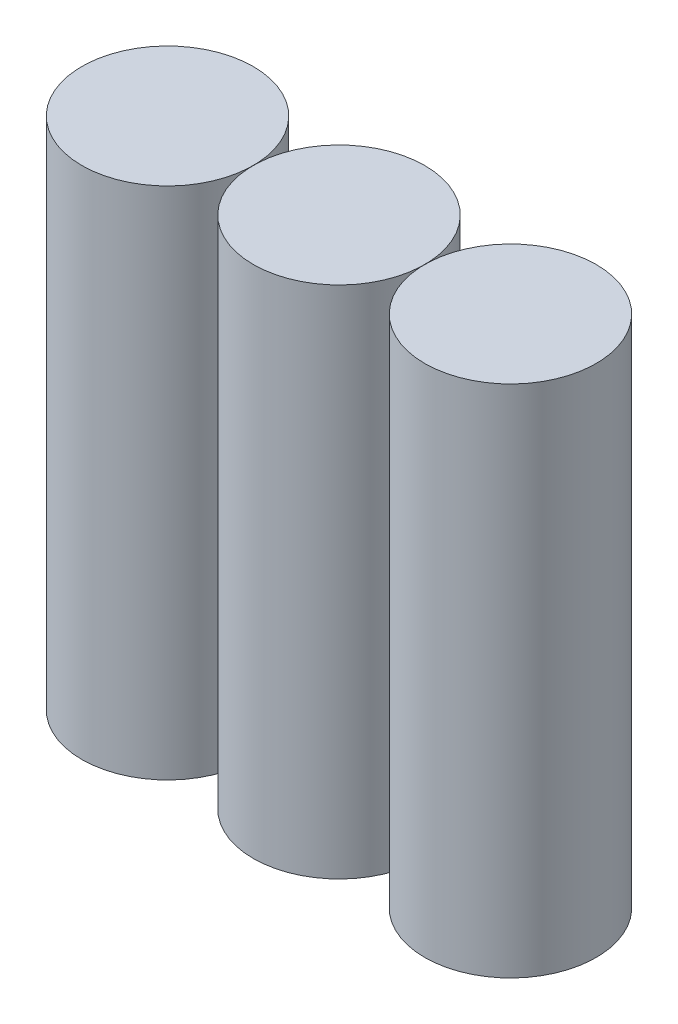
ISO-10303-21;
HEADER;
FILE_DESCRIPTION(('STEP AP214'),'2;1');
FILE_NAME('part.step','',(''),(''),'','','');
FILE_SCHEMA(('AUTOMOTIVE_DESIGN { 1 0 10303 214 1 1 1 1 }'));
ENDSEC;
DATA;
#1=APPLICATION_CONTEXT('core data for automotive mechanical design processes');
#2=APPLICATION_PROTOCOL_DEFINITION('international standard','automotive_design',2000,#1);
#3=PRODUCT_CONTEXT('',#1,'mechanical');
#4=PRODUCT('Part','Part','',(#3));
#5=PRODUCT_RELATED_PRODUCT_CATEGORY('part','',(#4));
#6=PRODUCT_DEFINITION_FORMATION('','',#4);
#7=PRODUCT_DEFINITION_CONTEXT('part definition',#1,'design');
#8=PRODUCT_DEFINITION('design','',#6,#7);
#9=PRODUCT_DEFINITION_SHAPE('','',#8);
#10=(LENGTH_UNIT() NAMED_UNIT(*) SI_UNIT(.MILLI.,.METRE.));
#11=(NAMED_UNIT(*) PLANE_ANGLE_UNIT() SI_UNIT($,.RADIAN.));
#12=(NAMED_UNIT(*) SI_UNIT($,.STERADIAN.) SOLID_ANGLE_UNIT());
#13=UNCERTAINTY_MEASURE_WITH_UNIT(LENGTH_MEASURE(1.E-05),#10,'distance_accuracy_value','');
#14=(GEOMETRIC_REPRESENTATION_CONTEXT(3) GLOBAL_UNCERTAINTY_ASSIGNED_CONTEXT((#13)) GLOBAL_UNIT_ASSIGNED_CONTEXT((#10,
#11,#12)) REPRESENTATION_CONTEXT('',''));
#15=CARTESIAN_POINT('',(0.,0.,0.));
#16=DIRECTION('',(0.,0.,1.));
#17=DIRECTION('',(1.,0.,0.));
#18=AXIS2_PLACEMENT_3D('',#15,#16,#17);
#19=CARTESIAN_POINT('',(5.,15.,0.));
#20=DIRECTION('',(0.,-1.,0.));
#21=DIRECTION('',(0.,0.,-1.));
#22=AXIS2_PLACEMENT_3D('',#19,#20,#21);
#23=CYLINDRICAL_SURFACE('',#22,2.5);
#24=CARTESIAN_POINT('',(5.,15.,0.));
#25=DIRECTION('',(0.,1.,0.));
#26=DIRECTION('',(0.,0.,1.));
#27=AXIS2_PLACEMENT_3D('',#24,#25,#26);
#28=CIRCLE('',#27,2.5);
#29=CARTESIAN_POINT('',(5.,15.,2.5));
#30=VERTEX_POINT('',#29);
#31=EDGE_CURVE('E12',#30,#30,#28,.T.);
#32=ORIENTED_EDGE('',*,*,#31,.F.);
#33=EDGE_LOOP('',(#32));
#34=FACE_BOUND('',#33,.T.);
#35=CARTESIAN_POINT('',(5.,0.,0.));
#36=DIRECTION('',(0.,1.,0.));
#37=DIRECTION('',(0.,0.,1.));
#38=AXIS2_PLACEMENT_3D('',#35,#36,#37);
#39=CIRCLE('',#38,2.5);
#40=CARTESIAN_POINT('',(5.,0.,2.5));
#41=VERTEX_POINT('',#40);
#42=EDGE_CURVE('E53',#41,#41,#39,.T.);
#43=ORIENTED_EDGE('',*,*,#42,.T.);
#44=EDGE_LOOP('',(#43));
#45=FACE_BOUND('',#44,.T.);
#46=ADVANCED_FACE('F50',(#34,#45),#23,.T.);
#47=CARTESIAN_POINT('',(0.,15.,0.));
#48=DIRECTION('',(0.,1.,0.));
#49=DIRECTION('',(0.,0.,1.));
#50=AXIS2_PLACEMENT_3D('',#47,#48,#49);
#51=PLANE('',#50);
#52=ORIENTED_EDGE('',*,*,#31,.T.);
#53=EDGE_LOOP('',(#52));
#54=FACE_BOUND('',#53,.T.);
#55=ADVANCED_FACE('F65',(#54),#51,.T.);
#56=CARTESIAN_POINT('',(0.,0.,0.));
#57=DIRECTION('',(0.,1.,0.));
#58=DIRECTION('',(0.,0.,1.));
#59=AXIS2_PLACEMENT_3D('',#56,#57,#58);
#60=PLANE('',#59);
#61=ORIENTED_EDGE('',*,*,#42,.F.);
#62=EDGE_LOOP('',(#61));
#63=FACE_BOUND('',#62,.T.);
#64=ADVANCED_FACE('F63',(#63),#60,.F.);
#65=CLOSED_SHELL('',(#46,#55,#64));
#66=MANIFOLD_SOLID_BREP('B2',#65);
#67=CARTESIAN_POINT('',(0.,15.,0.));
#68=DIRECTION('',(0.,-1.,0.));
#69=DIRECTION('',(0.,0.,-1.));
#70=AXIS2_PLACEMENT_3D('',#67,#68,#69);
#71=CYLINDRICAL_SURFACE('',#70,2.5);
#72=CARTESIAN_POINT('',(0.,15.,0.));
#73=DIRECTION('',(0.,1.,0.));
#74=DIRECTION('',(0.,0.,1.));
#75=AXIS2_PLACEMENT_3D('',#72,#73,#74);
#76=CIRCLE('',#75,2.5);
#77=CARTESIAN_POINT('',(0.,15.,2.5));
#78=VERTEX_POINT('',#77);
#79=EDGE_CURVE('E49',#78,#78,#76,.T.);
#80=ORIENTED_EDGE('',*,*,#79,.F.);
#81=EDGE_LOOP('',(#80));
#82=FACE_BOUND('',#81,.T.);
#83=CARTESIAN_POINT('',(0.,0.,0.));
#84=DIRECTION('',(0.,1.,0.));
#85=DIRECTION('',(0.,0.,1.));
#86=AXIS2_PLACEMENT_3D('',#83,#84,#85);
#87=CIRCLE('',#86,2.5);
#88=CARTESIAN_POINT('',(0.,0.,2.5));
#89=VERTEX_POINT('',#88);
#90=EDGE_CURVE('E107',#89,#89,#87,.T.);
#91=ORIENTED_EDGE('',*,*,#90,.T.);
#92=EDGE_LOOP('',(#91));
#93=FACE_BOUND('',#92,.T.);
#94=ADVANCED_FACE('F104',(#82,#93),#71,.T.);
#95=CARTESIAN_POINT('',(0.,15.,0.));
#96=DIRECTION('',(0.,1.,0.));
#97=DIRECTION('',(0.,0.,1.));
#98=AXIS2_PLACEMENT_3D('',#95,#96,#97);
#99=PLANE('',#98);
#100=ORIENTED_EDGE('',*,*,#79,.T.);
#101=EDGE_LOOP('',(#100));
#102=FACE_BOUND('',#101,.T.);
#103=ADVANCED_FACE('F119',(#102),#99,.T.);
#104=CARTESIAN_POINT('',(0.,0.,0.));
#105=DIRECTION('',(0.,1.,0.));
#106=DIRECTION('',(0.,0.,1.));
#107=AXIS2_PLACEMENT_3D('',#104,#105,#106);
#108=PLANE('',#107);
#109=ORIENTED_EDGE('',*,*,#90,.F.);
#110=EDGE_LOOP('',(#109));
#111=FACE_BOUND('',#110,.T.);
#112=ADVANCED_FACE('F117',(#111),#108,.F.);
#113=CLOSED_SHELL('',(#94,#103,#112));
#114=MANIFOLD_SOLID_BREP('B7',#113);
#115=CARTESIAN_POINT('',(-5.,15.,0.));
#116=DIRECTION('',(0.,-1.,0.));
#117=DIRECTION('',(0.,0.,-1.));
#118=AXIS2_PLACEMENT_3D('',#115,#116,#117);
#119=CYLINDRICAL_SURFACE('',#118,2.5);
#120=CARTESIAN_POINT('',(-5.,15.,0.));
#121=DIRECTION('',(0.,1.,0.));
#122=DIRECTION('',(0.,0.,1.));
#123=AXIS2_PLACEMENT_3D('',#120,#121,#122);
#124=CIRCLE('',#123,2.5);
#125=CARTESIAN_POINT('',(-5.,15.,2.5));
#126=VERTEX_POINT('',#125);
#127=EDGE_CURVE('E103',#126,#126,#124,.T.);
#128=ORIENTED_EDGE('',*,*,#127,.F.);
#129=EDGE_LOOP('',(#128));
#130=FACE_BOUND('',#129,.T.);
#131=CARTESIAN_POINT('',(-5.,0.,0.));
#132=DIRECTION('',(0.,1.,0.));
#133=DIRECTION('',(0.,0.,1.));
#134=AXIS2_PLACEMENT_3D('',#131,#132,#133);
#135=CIRCLE('',#134,2.5);
#136=CARTESIAN_POINT('',(-5.,0.,2.5));
#137=VERTEX_POINT('',#136);
#138=EDGE_CURVE('E154',#137,#137,#135,.T.);
#139=ORIENTED_EDGE('',*,*,#138,.T.);
#140=EDGE_LOOP('',(#139));
#141=FACE_BOUND('',#140,.T.);
#142=ADVANCED_FACE('F151',(#130,#141),#119,.T.);
#143=CARTESIAN_POINT('',(0.,15.,0.));
#144=DIRECTION('',(0.,1.,0.));
#145=DIRECTION('',(0.,0.,1.));
#146=AXIS2_PLACEMENT_3D('',#143,#144,#145);
#147=PLANE('',#146);
#148=ORIENTED_EDGE('',*,*,#127,.T.);
#149=EDGE_LOOP('',(#148));
#150=FACE_BOUND('',#149,.T.);
#151=ADVANCED_FACE('F166',(#150),#147,.T.);
#152=CARTESIAN_POINT('',(0.,0.,0.));
#153=DIRECTION('',(0.,1.,0.));
#154=DIRECTION('',(0.,0.,1.));
#155=AXIS2_PLACEMENT_3D('',#152,#153,#154);
#156=PLANE('',#155);
#157=ORIENTED_EDGE('',*,*,#138,.F.);
#158=EDGE_LOOP('',(#157));
#159=FACE_BOUND('',#158,.T.);
#160=ADVANCED_FACE('F164',(#159),#156,.F.);
#161=CLOSED_SHELL('',(#142,#151,#160));
#162=MANIFOLD_SOLID_BREP('B44',#161);
#163=ADVANCED_BREP_SHAPE_REPRESENTATION('',(#18,#66,#114,#162),#14);
#164=SHAPE_DEFINITION_REPRESENTATION(#9,#163);
ENDSEC;
END-ISO-10303-21;
